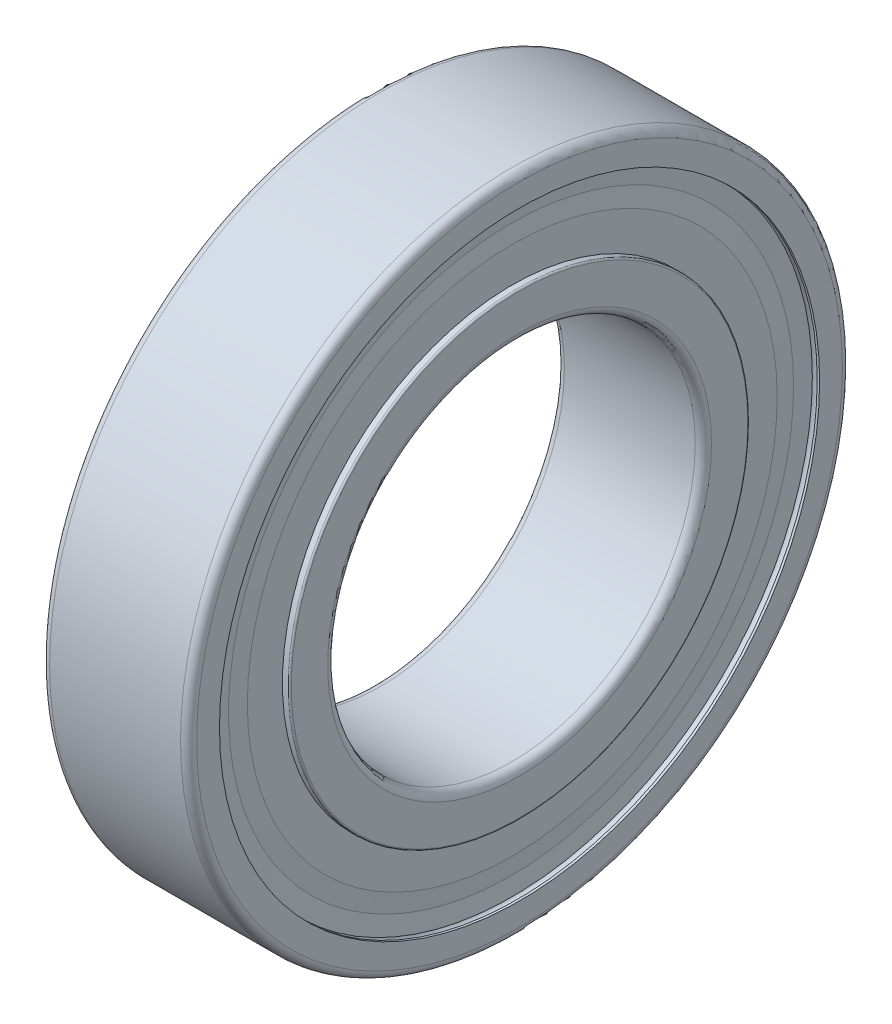
ISO-10303-21;
HEADER;
FILE_DESCRIPTION(('STEP AP214'),'2;1');
FILE_NAME('part.step','',(''),(''),'','','');
FILE_SCHEMA(('AUTOMOTIVE_DESIGN { 1 0 10303 214 1 1 1 1 }'));
ENDSEC;
DATA;
#1=APPLICATION_CONTEXT('core data for automotive mechanical design processes');
#2=APPLICATION_PROTOCOL_DEFINITION('international standard','automotive_design',2000,#1);
#3=PRODUCT_CONTEXT('',#1,'mechanical');
#4=PRODUCT('Part','Part','',(#3));
#5=PRODUCT_RELATED_PRODUCT_CATEGORY('part','',(#4));
#6=PRODUCT_DEFINITION_FORMATION('','',#4);
#7=PRODUCT_DEFINITION_CONTEXT('part definition',#1,'design');
#8=PRODUCT_DEFINITION('design','',#6,#7);
#9=PRODUCT_DEFINITION_SHAPE('','',#8);
#10=(LENGTH_UNIT() NAMED_UNIT(*) SI_UNIT(.MILLI.,.METRE.));
#11=(NAMED_UNIT(*) PLANE_ANGLE_UNIT() SI_UNIT($,.RADIAN.));
#12=(NAMED_UNIT(*) SI_UNIT($,.STERADIAN.) SOLID_ANGLE_UNIT());
#13=UNCERTAINTY_MEASURE_WITH_UNIT(LENGTH_MEASURE(1.E-05),#10,'distance_accuracy_value','');
#14=(GEOMETRIC_REPRESENTATION_CONTEXT(3) GLOBAL_UNCERTAINTY_ASSIGNED_CONTEXT((#13)) GLOBAL_UNIT_ASSIGNED_CONTEXT((#10,
#11,#12)) REPRESENTATION_CONTEXT('',''));
#15=CARTESIAN_POINT('',(0.,0.,0.));
#16=DIRECTION('',(0.,0.,1.));
#17=DIRECTION('',(1.,0.,0.));
#18=AXIS2_PLACEMENT_3D('',#15,#16,#17);
#19=CARTESIAN_POINT('',(18.68,0.,0.));
#20=DIRECTION('',(1.,0.,0.));
#21=DIRECTION('',(0.,0.,-1.));
#22=AXIS2_PLACEMENT_3D('',#19,#20,#21);
#23=CONICAL_SURFACE('',#22,40.805,1.4335885696);
#24=CARTESIAN_POINT('',(18.68,0.,0.));
#25=DIRECTION('',(1.,0.,0.));
#26=DIRECTION('',(0.,0.,-1.));
#27=AXIS2_PLACEMENT_3D('',#24,#25,#26);
#28=CIRCLE('',#27,40.805);
#29=CARTESIAN_POINT('',(18.68,0.,-40.805));
#30=VERTEX_POINT('',#29);
#31=EDGE_CURVE('P0_E40',#30,#30,#28,.T.);
#32=ORIENTED_EDGE('',*,*,#31,.F.);
#33=EDGE_LOOP('',(#32));
#34=FACE_BOUND('',#33,.T.);
#35=CARTESIAN_POINT('',(18.35,0.,0.));
#36=DIRECTION('',(1.,0.,0.));
#37=DIRECTION('',(0.,0.,-1.));
#38=AXIS2_PLACEMENT_3D('',#35,#36,#37);
#39=CIRCLE('',#38,38.415);
#40=CARTESIAN_POINT('',(18.35,0.,-38.415));
#41=VERTEX_POINT('',#40);
#42=EDGE_CURVE('P0_E11',#41,#41,#39,.T.);
#43=ORIENTED_EDGE('',*,*,#42,.T.);
#44=EDGE_LOOP('',(#43));
#45=FACE_BOUND('',#44,.T.);
#46=ADVANCED_FACE('P0_F17',(#34,#45),#23,.T.);
#47=CARTESIAN_POINT('',(18.35,38.415,0.));
#48=DIRECTION('',(-1.,0.,0.));
#49=DIRECTION('',(0.,0.,1.));
#50=AXIS2_PLACEMENT_3D('',#47,#48,#49);
#51=PLANE('',#50);
#52=ORIENTED_EDGE('',*,*,#42,.F.);
#53=EDGE_LOOP('',(#52));
#54=FACE_BOUND('',#53,.T.);
#55=CARTESIAN_POINT('',(18.35,0.,0.));
#56=DIRECTION('',(1.,0.,0.));
#57=DIRECTION('',(0.,0.,-1.));
#58=AXIS2_PLACEMENT_3D('',#55,#56,#57);
#59=CIRCLE('',#58,36.025);
#60=CARTESIAN_POINT('',(18.35,0.,-36.025));
#61=VERTEX_POINT('',#60);
#62=EDGE_CURVE('P0_E28',#61,#61,#59,.T.);
#63=ORIENTED_EDGE('',*,*,#62,.T.);
#64=EDGE_LOOP('',(#63));
#65=FACE_BOUND('',#64,.T.);
#66=ADVANCED_FACE('P0_F246',(#54,#65),#51,.T.);
#67=CARTESIAN_POINT('',(0.99,0.,0.));
#68=DIRECTION('',(-1.,0.,0.));
#69=DIRECTION('',(0.,0.,1.));
#70=AXIS2_PLACEMENT_3D('',#67,#68,#69);
#71=CONICAL_SURFACE('',#70,40.805,1.5018680397);
#72=CARTESIAN_POINT('',(0.99,0.,0.));
#73=DIRECTION('',(1.,0.,0.));
#74=DIRECTION('',(0.,0.,-1.));
#75=AXIS2_PLACEMENT_3D('',#72,#73,#74);
#76=CIRCLE('',#75,40.805);
#77=CARTESIAN_POINT('',(0.99,0.,-40.805));
#78=VERTEX_POINT('',#77);
#79=EDGE_CURVE('P0_E156',#78,#78,#76,.T.);
#80=ORIENTED_EDGE('',*,*,#79,.F.);
#81=EDGE_LOOP('',(#80));
#82=FACE_BOUND('',#81,.T.);
#83=CARTESIAN_POINT('',(1.155,0.,0.));
#84=DIRECTION('',(1.,0.,0.));
#85=DIRECTION('',(0.,0.,-1.));
#86=AXIS2_PLACEMENT_3D('',#83,#84,#85);
#87=CIRCLE('',#86,38.415);
#88=CARTESIAN_POINT('',(1.155,0.,-38.415));
#89=VERTEX_POINT('',#88);
#90=EDGE_CURVE('P0_E148',#89,#89,#87,.T.);
#91=ORIENTED_EDGE('',*,*,#90,.T.);
#92=EDGE_LOOP('',(#91));
#93=FACE_BOUND('',#92,.T.);
#94=ADVANCED_FACE('P0_F242',(#82,#93),#71,.F.);
#95=CARTESIAN_POINT('',(50.,0.,0.));
#96=DIRECTION('',(-1.,0.,0.));
#97=DIRECTION('',(0.,0.,-1.));
#98=AXIS2_PLACEMENT_3D('',#95,#96,#97);
#99=CYLINDRICAL_SURFACE('',#98,31.255);
#100=CARTESIAN_POINT('',(18.679309623431,0.,0.));
#101=DIRECTION('',(1.,0.,0.));
#102=DIRECTION('',(0.,0.,1.));
#103=AXIS2_PLACEMENT_3D('',#100,#101,#102);
#104=CIRCLE('',#103,31.255);
#105=CARTESIAN_POINT('',(18.679309623431,0.,31.255));
#106=VERTEX_POINT('',#105);
#107=EDGE_CURVE('P0_E170',#106,#106,#104,.T.);
#108=ORIENTED_EDGE('',*,*,#107,.F.);
#109=EDGE_LOOP('',(#108));
#110=FACE_BOUND('',#109,.T.);
#111=CARTESIAN_POINT('',(15.1281063756517,0.,0.));
#112=DIRECTION('',(1.,0.,0.));
#113=DIRECTION('',(0.,0.,-1.));
#114=AXIS2_PLACEMENT_3D('',#111,#112,#113);
#115=CIRCLE('',#114,31.255);
#116=CARTESIAN_POINT('',(15.1281063756517,0.,-31.255));
#117=VERTEX_POINT('',#116);
#118=EDGE_CURVE('P0_E140',#117,#117,#115,.T.);
#119=ORIENTED_EDGE('',*,*,#118,.T.);
#120=EDGE_LOOP('',(#119));
#121=FACE_BOUND('',#120,.T.);
#122=ADVANCED_FACE('P0_F245',(#110,#121),#99,.T.);
#123=CARTESIAN_POINT('',(50.,0.,0.));
#124=DIRECTION('',(-1.,0.,0.));
#125=DIRECTION('',(0.,0.,-1.));
#126=AXIS2_PLACEMENT_3D('',#123,#124,#125);
#127=CYLINDRICAL_SURFACE('',#126,31.255);
#128=CARTESIAN_POINT('',(0.99,0.,0.));
#129=DIRECTION('',(1.,0.,0.));
#130=DIRECTION('',(0.,0.,1.));
#131=AXIS2_PLACEMENT_3D('',#128,#129,#130);
#132=CIRCLE('',#131,31.255);
#133=CARTESIAN_POINT('',(0.99,0.,31.255));
#134=VERTEX_POINT('',#133);
#135=EDGE_CURVE('P0_E176',#134,#134,#132,.T.);
#136=ORIENTED_EDGE('',*,*,#135,.F.);
#137=EDGE_LOOP('',(#136));
#138=FACE_BOUND('',#137,.T.);
#139=CARTESIAN_POINT('',(0.22,0.,0.));
#140=DIRECTION('',(1.,0.,0.));
#141=DIRECTION('',(0.,0.,-1.));
#142=AXIS2_PLACEMENT_3D('',#139,#140,#141);
#143=CIRCLE('',#142,31.255);
#144=CARTESIAN_POINT('',(0.22,0.,-31.255));
#145=VERTEX_POINT('',#144);
#146=EDGE_CURVE('P0_E135',#145,#145,#143,.T.);
#147=ORIENTED_EDGE('',*,*,#146,.T.);
#148=EDGE_LOOP('',(#147));
#149=FACE_BOUND('',#148,.T.);
#150=ADVANCED_FACE('P0_F259',(#138,#149),#127,.T.);
#151=CARTESIAN_POINT('',(50.,0.,0.));
#152=DIRECTION('',(-1.,0.,0.));
#153=DIRECTION('',(0.,0.,-1.));
#154=AXIS2_PLACEMENT_3D('',#151,#152,#153);
#155=CYLINDRICAL_SURFACE('',#154,31.255);
#156=CARTESIAN_POINT('',(19.78,0.,0.));
#157=DIRECTION('',(1.,0.,0.));
#158=DIRECTION('',(0.,0.,-1.));
#159=AXIS2_PLACEMENT_3D('',#156,#157,#158);
#160=CIRCLE('',#159,31.255);
#161=CARTESIAN_POINT('',(19.78,0.,-31.255));
#162=VERTEX_POINT('',#161);
#163=EDGE_CURVE('P0_E152',#162,#162,#160,.T.);
#164=ORIENTED_EDGE('',*,*,#163,.F.);
#165=EDGE_LOOP('',(#164));
#166=FACE_BOUND('',#165,.T.);
#167=CARTESIAN_POINT('',(19.01,0.,0.));
#168=DIRECTION('',(-1.,0.,0.));
#169=DIRECTION('',(0.,0.,-1.));
#170=AXIS2_PLACEMENT_3D('',#167,#168,#169);
#171=CIRCLE('',#170,31.255);
#172=CARTESIAN_POINT('',(19.01,0.,-31.255));
#173=VERTEX_POINT('',#172);
#174=EDGE_CURVE('P0_E216',#173,#173,#171,.T.);
#175=ORIENTED_EDGE('',*,*,#174,.F.);
#176=EDGE_LOOP('',(#175));
#177=FACE_BOUND('',#176,.T.);
#178=ADVANCED_FACE('P0_F261',(#166,#177),#155,.T.);
#179=CARTESIAN_POINT('',(10.,0.,0.));
#180=DIRECTION('',(1.,0.,0.));
#181=DIRECTION('',(0.,0.,-1.));
#182=AXIS2_PLACEMENT_3D('',#179,#180,#181);
#183=TOROIDAL_SURFACE('',#182,35.,6.35);
#184=CARTESIAN_POINT('',(4.87189362434826,0.,0.));
#185=DIRECTION('',(1.,0.,0.));
#186=DIRECTION('',(0.,0.,-1.));
#187=AXIS2_PLACEMENT_3D('',#184,#185,#186);
#188=CIRCLE('',#187,31.255);
#189=CARTESIAN_POINT('',(4.87189362434826,0.,-31.255));
#190=VERTEX_POINT('',#189);
#191=EDGE_CURVE('P0_E141',#190,#190,#188,.T.);
#192=ORIENTED_EDGE('',*,*,#191,.T.);
#193=EDGE_LOOP('',(#192));
#194=FACE_BOUND('',#193,.T.);
#195=ORIENTED_EDGE('',*,*,#118,.F.);
#196=EDGE_LOOP('',(#195));
#197=FACE_BOUND('',#196,.T.);
#198=ADVANCED_FACE('P0_F269',(#194,#197),#183,.F.);
#199=CARTESIAN_POINT('',(19.78,0.,0.));
#200=DIRECTION('',(1.,0.,0.));
#201=DIRECTION('',(0.,0.,-1.));
#202=AXIS2_PLACEMENT_3D('',#199,#200,#201);
#203=TOROIDAL_SURFACE('',#202,31.035,0.22);
#204=CARTESIAN_POINT('',(20.,0.,0.));
#205=DIRECTION('',(1.,0.,0.));
#206=DIRECTION('',(0.,0.,-1.));
#207=AXIS2_PLACEMENT_3D('',#204,#205,#206);
#208=CIRCLE('',#207,31.035);
#209=CARTESIAN_POINT('',(20.,0.,-31.035));
#210=VERTEX_POINT('',#209);
#211=EDGE_CURVE('P0_E158',#210,#210,#208,.T.);
#212=ORIENTED_EDGE('',*,*,#211,.F.);
#213=EDGE_LOOP('',(#212));
#214=FACE_BOUND('',#213,.T.);
#215=ORIENTED_EDGE('',*,*,#163,.T.);
#216=EDGE_LOOP('',(#215));
#217=FACE_BOUND('',#216,.T.);
#218=ADVANCED_FACE('P0_F321',(#214,#217),#203,.T.);
#219=CARTESIAN_POINT('',(20.,26.1,0.));
#220=DIRECTION('',(1.,0.,0.));
#221=DIRECTION('',(0.,1.,0.));
#222=AXIS2_PLACEMENT_3D('',#219,#220,#221);
#223=PLANE('',#222);
#224=ORIENTED_EDGE('',*,*,#211,.T.);
#225=EDGE_LOOP('',(#224));
#226=FACE_BOUND('',#225,.T.);
#227=CARTESIAN_POINT('',(20.,0.,0.));
#228=DIRECTION('',(1.,0.,0.));
#229=DIRECTION('',(0.,0.,-1.));
#230=AXIS2_PLACEMENT_3D('',#227,#228,#229);
#231=CIRCLE('',#230,26.1);
#232=CARTESIAN_POINT('',(20.,0.,-26.1));
#233=VERTEX_POINT('',#232);
#234=EDGE_CURVE('P0_E161',#233,#233,#231,.T.);
#235=ORIENTED_EDGE('',*,*,#234,.F.);
#236=EDGE_LOOP('',(#235));
#237=FACE_BOUND('',#236,.T.);
#238=ADVANCED_FACE('P0_F336',(#226,#237),#223,.T.);
#239=CARTESIAN_POINT('',(18.9,0.,0.));
#240=DIRECTION('',(1.,0.,0.));
#241=DIRECTION('',(0.,0.,-1.));
#242=AXIS2_PLACEMENT_3D('',#239,#240,#241);
#243=TOROIDAL_SURFACE('',#242,26.1,1.1);
#244=CARTESIAN_POINT('',(18.9,0.,0.));
#245=DIRECTION('',(1.,0.,0.));
#246=DIRECTION('',(0.,0.,-1.));
#247=AXIS2_PLACEMENT_3D('',#244,#245,#246);
#248=CIRCLE('',#247,25.);
#249=CARTESIAN_POINT('',(18.9,0.,-25.));
#250=VERTEX_POINT('',#249);
#251=EDGE_CURVE('P0_E162',#250,#250,#248,.T.);
#252=ORIENTED_EDGE('',*,*,#251,.F.);
#253=EDGE_LOOP('',(#252));
#254=FACE_BOUND('',#253,.T.);
#255=ORIENTED_EDGE('',*,*,#234,.T.);
#256=EDGE_LOOP('',(#255));
#257=FACE_BOUND('',#256,.T.);
#258=ADVANCED_FACE('P0_F19',(#254,#257),#243,.T.);
#259=CARTESIAN_POINT('',(50.,0.,0.));
#260=DIRECTION('',(-1.,0.,0.));
#261=DIRECTION('',(0.,0.,-1.));
#262=AXIS2_PLACEMENT_3D('',#259,#260,#261);
#263=CYLINDRICAL_SURFACE('',#262,25.);
#264=CARTESIAN_POINT('',(1.1,0.,0.));
#265=DIRECTION('',(1.,0.,0.));
#266=DIRECTION('',(0.,0.,-1.));
#267=AXIS2_PLACEMENT_3D('',#264,#265,#266);
#268=CIRCLE('',#267,25.);
#269=CARTESIAN_POINT('',(1.1,0.,-25.));
#270=VERTEX_POINT('',#269);
#271=EDGE_CURVE('P0_E166',#270,#270,#268,.T.);
#272=ORIENTED_EDGE('',*,*,#271,.F.);
#273=EDGE_LOOP('',(#272));
#274=FACE_BOUND('',#273,.T.);
#275=ORIENTED_EDGE('',*,*,#251,.T.);
#276=EDGE_LOOP('',(#275));
#277=FACE_BOUND('',#276,.T.);
#278=ADVANCED_FACE('P0_F300',(#274,#277),#263,.F.);
#279=CARTESIAN_POINT('',(1.1,0.,0.));
#280=DIRECTION('',(1.,0.,0.));
#281=DIRECTION('',(0.,0.,-1.));
#282=AXIS2_PLACEMENT_3D('',#279,#280,#281);
#283=TOROIDAL_SURFACE('',#282,26.1,1.1);
#284=CARTESIAN_POINT('',(0.,0.,0.));
#285=DIRECTION('',(1.,0.,0.));
#286=DIRECTION('',(0.,0.,-1.));
#287=AXIS2_PLACEMENT_3D('',#284,#285,#286);
#288=CIRCLE('',#287,26.1);
#289=CARTESIAN_POINT('',(0.,0.,-26.1));
#290=VERTEX_POINT('',#289);
#291=EDGE_CURVE('P0_E205',#290,#290,#288,.T.);
#292=ORIENTED_EDGE('',*,*,#291,.F.);
#293=EDGE_LOOP('',(#292));
#294=FACE_BOUND('',#293,.T.);
#295=ORIENTED_EDGE('',*,*,#271,.T.);
#296=EDGE_LOOP('',(#295));
#297=FACE_BOUND('',#296,.T.);
#298=ADVANCED_FACE('P0_F298',(#294,#297),#283,.T.);
#299=CARTESIAN_POINT('',(0.,31.035,0.));
#300=DIRECTION('',(-1.,0.,0.));
#301=DIRECTION('',(0.,0.,1.));
#302=AXIS2_PLACEMENT_3D('',#299,#300,#301);
#303=PLANE('',#302);
#304=CARTESIAN_POINT('',(0.,0.,0.));
#305=DIRECTION('',(1.,0.,0.));
#306=DIRECTION('',(0.,0.,-1.));
#307=AXIS2_PLACEMENT_3D('',#304,#305,#306);
#308=CIRCLE('',#307,31.035);
#309=CARTESIAN_POINT('',(0.,0.,-31.035));
#310=VERTEX_POINT('',#309);
#311=EDGE_CURVE('P0_E21',#310,#310,#308,.T.);
#312=ORIENTED_EDGE('',*,*,#311,.F.);
#313=EDGE_LOOP('',(#312));
#314=FACE_BOUND('',#313,.T.);
#315=ORIENTED_EDGE('',*,*,#291,.T.);
#316=EDGE_LOOP('',(#315));
#317=FACE_BOUND('',#316,.T.);
#318=ADVANCED_FACE('P0_F287',(#314,#317),#303,.T.);
#319=CARTESIAN_POINT('',(0.219999999999994,0.,0.));
#320=DIRECTION('',(1.,0.,0.));
#321=DIRECTION('',(0.,0.,-1.));
#322=AXIS2_PLACEMENT_3D('',#319,#320,#321);
#323=TOROIDAL_SURFACE('',#322,31.035,0.22);
#324=ORIENTED_EDGE('',*,*,#146,.F.);
#325=EDGE_LOOP('',(#324));
#326=FACE_BOUND('',#325,.T.);
#327=ORIENTED_EDGE('',*,*,#311,.T.);
#328=EDGE_LOOP('',(#327));
#329=FACE_BOUND('',#328,.T.);
#330=ADVANCED_FACE('P0_F136',(#326,#329),#323,.T.);
#331=CARTESIAN_POINT('',(0.99,36.025,0.));
#332=DIRECTION('',(-1.,0.,0.));
#333=DIRECTION('',(0.,0.,1.));
#334=AXIS2_PLACEMENT_3D('',#331,#332,#333);
#335=PLANE('',#334);
#336=CARTESIAN_POINT('',(0.99,0.,0.));
#337=DIRECTION('',(1.,0.,0.));
#338=DIRECTION('',(0.,0.,-1.));
#339=AXIS2_PLACEMENT_3D('',#336,#337,#338);
#340=CIRCLE('',#339,36.025);
#341=CARTESIAN_POINT('',(0.99,0.,-36.025));
#342=VERTEX_POINT('',#341);
#343=EDGE_CURVE('P0_E180',#342,#342,#340,.T.);
#344=ORIENTED_EDGE('',*,*,#343,.F.);
#345=EDGE_LOOP('',(#344));
#346=FACE_BOUND('',#345,.T.);
#347=ORIENTED_EDGE('',*,*,#135,.T.);
#348=EDGE_LOOP('',(#347));
#349=FACE_BOUND('',#348,.T.);
#350=ADVANCED_FACE('P0_F252',(#346,#349),#335,.T.);
#351=CARTESIAN_POINT('',(1.155,0.,0.));
#352=DIRECTION('',(1.,0.,0.));
#353=DIRECTION('',(0.,0.,-1.));
#354=AXIS2_PLACEMENT_3D('',#351,#352,#353);
#355=CONICAL_SURFACE('',#354,38.415,1.5018680397);
#356=ORIENTED_EDGE('',*,*,#90,.F.);
#357=EDGE_LOOP('',(#356));
#358=FACE_BOUND('',#357,.T.);
#359=ORIENTED_EDGE('',*,*,#343,.T.);
#360=EDGE_LOOP('',(#359));
#361=FACE_BOUND('',#360,.T.);
#362=ADVANCED_FACE('P0_F249',(#358,#361),#355,.T.);
#363=CARTESIAN_POINT('',(50.,0.,0.));
#364=DIRECTION('',(-1.,0.,0.));
#365=DIRECTION('',(0.,0.,-1.));
#366=AXIS2_PLACEMENT_3D('',#363,#364,#365);
#367=CYLINDRICAL_SURFACE('',#366,40.805);
#368=CARTESIAN_POINT('',(1.32,0.,0.));
#369=DIRECTION('',(1.,0.,0.));
#370=DIRECTION('',(0.,0.,-1.));
#371=AXIS2_PLACEMENT_3D('',#368,#369,#370);
#372=CIRCLE('',#371,40.805);
#373=CARTESIAN_POINT('',(1.32,0.,-40.805));
#374=VERTEX_POINT('',#373);
#375=EDGE_CURVE('P0_E188',#374,#374,#372,.T.);
#376=ORIENTED_EDGE('',*,*,#375,.F.);
#377=EDGE_LOOP('',(#376));
#378=FACE_BOUND('',#377,.T.);
#379=ORIENTED_EDGE('',*,*,#79,.T.);
#380=EDGE_LOOP('',(#379));
#381=FACE_BOUND('',#380,.T.);
#382=ADVANCED_FACE('P0_F240',(#378,#381),#367,.T.);
#383=CARTESIAN_POINT('',(1.65,0.,0.));
#384=DIRECTION('',(-1.,0.,0.));
#385=DIRECTION('',(0.,0.,1.));
#386=AXIS2_PLACEMENT_3D('',#383,#384,#385);
#387=CONICAL_SURFACE('',#386,38.415,1.4335885696);
#388=ORIENTED_EDGE('',*,*,#375,.T.);
#389=EDGE_LOOP('',(#388));
#390=FACE_BOUND('',#389,.T.);
#391=CARTESIAN_POINT('',(1.65,0.,0.));
#392=DIRECTION('',(1.,0.,0.));
#393=DIRECTION('',(0.,0.,-1.));
#394=AXIS2_PLACEMENT_3D('',#391,#392,#393);
#395=CIRCLE('',#394,38.415);
#396=CARTESIAN_POINT('',(1.65,0.,-38.415));
#397=VERTEX_POINT('',#396);
#398=EDGE_CURVE('P0_E184',#397,#397,#395,.T.);
#399=ORIENTED_EDGE('',*,*,#398,.F.);
#400=EDGE_LOOP('',(#399));
#401=FACE_BOUND('',#400,.T.);
#402=ADVANCED_FACE('P0_F305',(#390,#401),#387,.T.);
#403=CARTESIAN_POINT('',(1.65,36.025,0.));
#404=DIRECTION('',(1.,0.,0.));
#405=DIRECTION('',(0.,1.,0.));
#406=AXIS2_PLACEMENT_3D('',#403,#404,#405);
#407=PLANE('',#406);
#408=ORIENTED_EDGE('',*,*,#398,.T.);
#409=EDGE_LOOP('',(#408));
#410=FACE_BOUND('',#409,.T.);
#411=CARTESIAN_POINT('',(1.65,0.,0.));
#412=DIRECTION('',(1.,0.,0.));
#413=DIRECTION('',(0.,0.,-1.));
#414=AXIS2_PLACEMENT_3D('',#411,#412,#413);
#415=CIRCLE('',#414,36.025);
#416=CARTESIAN_POINT('',(1.65,0.,-36.025));
#417=VERTEX_POINT('',#416);
#418=EDGE_CURVE('P0_E189',#417,#417,#415,.T.);
#419=ORIENTED_EDGE('',*,*,#418,.F.);
#420=EDGE_LOOP('',(#419));
#421=FACE_BOUND('',#420,.T.);
#422=ADVANCED_FACE('P0_F292',(#410,#421),#407,.T.);
#423=CARTESIAN_POINT('',(1.32,0.,0.));
#424=DIRECTION('',(1.,0.,0.));
#425=DIRECTION('',(0.,0.,-1.));
#426=AXIS2_PLACEMENT_3D('',#423,#424,#425);
#427=CONICAL_SURFACE('',#426,31.245,1.5018680397);
#428=ORIENTED_EDGE('',*,*,#418,.T.);
#429=EDGE_LOOP('',(#428));
#430=FACE_BOUND('',#429,.T.);
#431=CARTESIAN_POINT('',(1.32069037656904,0.,0.));
#432=DIRECTION('',(-1.,0.,0.));
#433=DIRECTION('',(0.,0.,-1.));
#434=AXIS2_PLACEMENT_3D('',#431,#432,#433);
#435=CIRCLE('',#434,31.255);
#436=CARTESIAN_POINT('',(1.32069037656904,0.,-31.255));
#437=VERTEX_POINT('',#436);
#438=EDGE_CURVE('P0_E174',#437,#437,#435,.T.);
#439=ORIENTED_EDGE('',*,*,#438,.T.);
#440=EDGE_LOOP('',(#439));
#441=FACE_BOUND('',#440,.T.);
#442=ADVANCED_FACE('P0_F288',(#430,#441),#427,.F.);
#443=CARTESIAN_POINT('',(50.,0.,0.));
#444=DIRECTION('',(-1.,0.,0.));
#445=DIRECTION('',(0.,0.,-1.));
#446=AXIS2_PLACEMENT_3D('',#443,#444,#445);
#447=CYLINDRICAL_SURFACE('',#446,31.255);
#448=ORIENTED_EDGE('',*,*,#191,.F.);
#449=EDGE_LOOP('',(#448));
#450=FACE_BOUND('',#449,.T.);
#451=ORIENTED_EDGE('',*,*,#438,.F.);
#452=EDGE_LOOP('',(#451));
#453=FACE_BOUND('',#452,.T.);
#454=ADVANCED_FACE('P0_F291',(#450,#453),#447,.T.);
#455=CARTESIAN_POINT('',(18.35,0.,0.));
#456=DIRECTION('',(-1.,0.,0.));
#457=DIRECTION('',(0.,0.,1.));
#458=AXIS2_PLACEMENT_3D('',#455,#456,#457);
#459=CONICAL_SURFACE('',#458,36.025,1.5018680397);
#460=ORIENTED_EDGE('',*,*,#62,.F.);
#461=EDGE_LOOP('',(#460));
#462=FACE_BOUND('',#461,.T.);
#463=ORIENTED_EDGE('',*,*,#107,.T.);
#464=EDGE_LOOP('',(#463));
#465=FACE_BOUND('',#464,.T.);
#466=ADVANCED_FACE('P0_F296',(#462,#465),#459,.F.);
#467=CARTESIAN_POINT('',(19.01,31.245,0.));
#468=DIRECTION('',(1.,0.,0.));
#469=DIRECTION('',(0.,1.,0.));
#470=AXIS2_PLACEMENT_3D('',#467,#468,#469);
#471=PLANE('',#470);
#472=CARTESIAN_POINT('',(19.01,0.,0.));
#473=DIRECTION('',(1.,0.,0.));
#474=DIRECTION('',(0.,0.,-1.));
#475=AXIS2_PLACEMENT_3D('',#472,#473,#474);
#476=CIRCLE('',#475,36.025);
#477=CARTESIAN_POINT('',(19.01,0.,-36.025));
#478=VERTEX_POINT('',#477);
#479=EDGE_CURVE('P0_E175',#478,#478,#476,.T.);
#480=ORIENTED_EDGE('',*,*,#479,.T.);
#481=EDGE_LOOP('',(#480));
#482=FACE_BOUND('',#481,.T.);
#483=ORIENTED_EDGE('',*,*,#174,.T.);
#484=EDGE_LOOP('',(#483));
#485=FACE_BOUND('',#484,.T.);
#486=ADVANCED_FACE('P0_F310',(#482,#485),#471,.T.);
#487=CARTESIAN_POINT('',(19.01,0.,0.));
#488=DIRECTION('',(-1.,0.,0.));
#489=DIRECTION('',(0.,0.,1.));
#490=AXIS2_PLACEMENT_3D('',#487,#488,#489);
#491=CONICAL_SURFACE('',#490,36.025,1.5018680397);
#492=CARTESIAN_POINT('',(18.845,0.,0.));
#493=DIRECTION('',(1.,0.,0.));
#494=DIRECTION('',(0.,0.,-1.));
#495=AXIS2_PLACEMENT_3D('',#492,#493,#494);
#496=CIRCLE('',#495,38.415);
#497=CARTESIAN_POINT('',(18.845,0.,-38.415));
#498=VERTEX_POINT('',#497);
#499=EDGE_CURVE('P0_E210',#498,#498,#496,.T.);
#500=ORIENTED_EDGE('',*,*,#499,.T.);
#501=EDGE_LOOP('',(#500));
#502=FACE_BOUND('',#501,.T.);
#503=ORIENTED_EDGE('',*,*,#479,.F.);
#504=EDGE_LOOP('',(#503));
#505=FACE_BOUND('',#504,.T.);
#506=ADVANCED_FACE('P0_F307',(#502,#505),#491,.T.);
#507=CARTESIAN_POINT('',(18.845,0.,0.));
#508=DIRECTION('',(1.,0.,0.));
#509=DIRECTION('',(0.,0.,-1.));
#510=AXIS2_PLACEMENT_3D('',#507,#508,#509);
#511=CONICAL_SURFACE('',#510,38.415,1.5018680397);
#512=CARTESIAN_POINT('',(19.01,0.,0.));
#513=DIRECTION('',(1.,0.,0.));
#514=DIRECTION('',(0.,0.,-1.));
#515=AXIS2_PLACEMENT_3D('',#512,#513,#514);
#516=CIRCLE('',#515,40.805);
#517=CARTESIAN_POINT('',(19.01,0.,-40.805));
#518=VERTEX_POINT('',#517);
#519=EDGE_CURVE('P0_E182',#518,#518,#516,.T.);
#520=ORIENTED_EDGE('',*,*,#519,.T.);
#521=EDGE_LOOP('',(#520));
#522=FACE_BOUND('',#521,.T.);
#523=ORIENTED_EDGE('',*,*,#499,.F.);
#524=EDGE_LOOP('',(#523));
#525=FACE_BOUND('',#524,.T.);
#526=ADVANCED_FACE('P0_F309',(#522,#525),#511,.F.);
#527=CARTESIAN_POINT('',(50.,0.,0.));
#528=DIRECTION('',(-1.,0.,0.));
#529=DIRECTION('',(0.,0.,-1.));
#530=AXIS2_PLACEMENT_3D('',#527,#528,#529);
#531=CYLINDRICAL_SURFACE('',#530,40.805);
#532=ORIENTED_EDGE('',*,*,#519,.F.);
#533=EDGE_LOOP('',(#532));
#534=FACE_BOUND('',#533,.T.);
#535=ORIENTED_EDGE('',*,*,#31,.T.);
#536=EDGE_LOOP('',(#535));
#537=FACE_BOUND('',#536,.T.);
#538=ADVANCED_FACE('P0_F324',(#534,#537),#531,.T.);
#539=CLOSED_SHELL('',(#46,#66,#94,#122,#150,#178,#198,#218,#238,#258,#278,#298,#318,#330,#350,
#362,#382,#402,#422,#442,#454,#466,#486,#506,#526,#538));
#540=MANIFOLD_SOLID_BREP('P0_B1',#539);
#541=CARTESIAN_POINT('',(1.09999999999998,0.,0.));
#542=DIRECTION('',(1.,0.,0.));
#543=DIRECTION('',(0.,0.,-1.));
#544=AXIS2_PLACEMENT_3D('',#541,#542,#543);
#545=TOROIDAL_SURFACE('',#544,43.9,1.1);
#546=CARTESIAN_POINT('',(1.1,0.,0.));
#547=DIRECTION('',(1.,0.,0.));
#548=DIRECTION('',(0.,0.,-1.));
#549=AXIS2_PLACEMENT_3D('',#546,#547,#548);
#550=CIRCLE('',#549,45.);
#551=CARTESIAN_POINT('',(1.1,0.,-45.));
#552=VERTEX_POINT('',#551);
#553=EDGE_CURVE('P1_E40',#552,#552,#550,.T.);
#554=ORIENTED_EDGE('',*,*,#553,.F.);
#555=EDGE_LOOP('',(#554));
#556=FACE_BOUND('',#555,.T.);
#557=CARTESIAN_POINT('',(0.,0.,0.));
#558=DIRECTION('',(1.,0.,0.));
#559=DIRECTION('',(0.,0.,-1.));
#560=AXIS2_PLACEMENT_3D('',#557,#558,#559);
#561=CIRCLE('',#560,43.9);
#562=CARTESIAN_POINT('',(0.,0.,-43.9));
#563=VERTEX_POINT('',#562);
#564=EDGE_CURVE('P1_E11',#563,#563,#561,.T.);
#565=ORIENTED_EDGE('',*,*,#564,.T.);
#566=EDGE_LOOP('',(#565));
#567=FACE_BOUND('',#566,.T.);
#568=ADVANCED_FACE('P1_F17',(#556,#567),#545,.T.);
#569=CARTESIAN_POINT('',(0.,43.9,0.));
#570=DIRECTION('',(-1.,0.,0.));
#571=DIRECTION('',(0.,0.,1.));
#572=AXIS2_PLACEMENT_3D('',#569,#570,#571);
#573=PLANE('',#572);
#574=ORIENTED_EDGE('',*,*,#564,.F.);
#575=EDGE_LOOP('',(#574));
#576=FACE_BOUND('',#575,.T.);
#577=CARTESIAN_POINT('',(0.,0.,0.));
#578=DIRECTION('',(1.,0.,0.));
#579=DIRECTION('',(0.,0.,-1.));
#580=AXIS2_PLACEMENT_3D('',#577,#578,#579);
#581=CIRCLE('',#580,40.805);
#582=CARTESIAN_POINT('',(0.,0.,-40.805));
#583=VERTEX_POINT('',#582);
#584=EDGE_CURVE('P1_E28',#583,#583,#581,.T.);
#585=ORIENTED_EDGE('',*,*,#584,.T.);
#586=EDGE_LOOP('',(#585));
#587=FACE_BOUND('',#586,.T.);
#588=ADVANCED_FACE('P1_F174',(#576,#587),#573,.T.);
#589=CARTESIAN_POINT('',(50.,0.,0.));
#590=DIRECTION('',(-1.,0.,0.));
#591=DIRECTION('',(0.,0.,-1.));
#592=AXIS2_PLACEMENT_3D('',#589,#590,#591);
#593=CYLINDRICAL_SURFACE('',#592,40.805);
#594=ORIENTED_EDGE('',*,*,#584,.F.);
#595=EDGE_LOOP('',(#594));
#596=FACE_BOUND('',#595,.T.);
#597=CARTESIAN_POINT('',(0.33,0.,0.));
#598=DIRECTION('',(1.,0.,0.));
#599=DIRECTION('',(0.,0.,-1.));
#600=AXIS2_PLACEMENT_3D('',#597,#598,#599);
#601=CIRCLE('',#600,40.805);
#602=CARTESIAN_POINT('',(0.33,0.,-40.805));
#603=VERTEX_POINT('',#602);
#604=EDGE_CURVE('P1_E102',#603,#603,#601,.T.);
#605=ORIENTED_EDGE('',*,*,#604,.T.);
#606=EDGE_LOOP('',(#605));
#607=FACE_BOUND('',#606,.T.);
#608=ADVANCED_FACE('P1_F180',(#596,#607),#593,.F.);
#609=CARTESIAN_POINT('',(0.99,0.,0.));
#610=DIRECTION('',(1.,0.,0.));
#611=DIRECTION('',(0.,0.,-1.));
#612=AXIS2_PLACEMENT_3D('',#609,#610,#611);
#613=TOROIDAL_SURFACE('',#612,40.805,0.66);
#614=CARTESIAN_POINT('',(1.65,0.,0.));
#615=DIRECTION('',(1.,0.,0.));
#616=DIRECTION('',(0.,0.,-1.));
#617=AXIS2_PLACEMENT_3D('',#614,#615,#616);
#618=CIRCLE('',#617,40.805);
#619=CARTESIAN_POINT('',(1.65,0.,-40.805));
#620=VERTEX_POINT('',#619);
#621=EDGE_CURVE('P1_E108',#620,#620,#618,.T.);
#622=ORIENTED_EDGE('',*,*,#621,.T.);
#623=EDGE_LOOP('',(#622));
#624=FACE_BOUND('',#623,.T.);
#625=ORIENTED_EDGE('',*,*,#604,.F.);
#626=EDGE_LOOP('',(#625));
#627=FACE_BOUND('',#626,.T.);
#628=CARTESIAN_POINT('',(0.99,0.,-41.465));
#629=VERTEX_POINT('',#628);
#630=VERTEX_LOOP('',#629);
#631=FACE_BOUND('',#630,.T.);
#632=ADVANCED_FACE('P1_F196',(#624,#627,#631),#613,.F.);
#633=CARTESIAN_POINT('',(1.65,0.,0.));
#634=DIRECTION('',(-1.,0.,0.));
#635=DIRECTION('',(0.,0.,1.));
#636=AXIS2_PLACEMENT_3D('',#633,#634,#635);
#637=CONICAL_SURFACE('',#636,40.805,1.3962634016);
#638=ORIENTED_EDGE('',*,*,#621,.F.);
#639=EDGE_LOOP('',(#638));
#640=FACE_BOUND('',#639,.T.);
#641=CARTESIAN_POINT('',(1.92330682009812,0.,0.));
#642=DIRECTION('',(1.,0.,0.));
#643=DIRECTION('',(0.,0.,-1.));
#644=AXIS2_PLACEMENT_3D('',#641,#642,#643);
#645=CIRCLE('',#644,39.255);
#646=CARTESIAN_POINT('',(1.92330682009812,0.,-39.255));
#647=VERTEX_POINT('',#646);
#648=EDGE_CURVE('P1_E113',#647,#647,#645,.T.);
#649=ORIENTED_EDGE('',*,*,#648,.T.);
#650=EDGE_LOOP('',(#649));
#651=FACE_BOUND('',#650,.T.);
#652=ADVANCED_FACE('P1_F109',(#640,#651),#637,.F.);
#653=CARTESIAN_POINT('',(50.,0.,0.));
#654=DIRECTION('',(-1.,0.,0.));
#655=DIRECTION('',(0.,0.,-1.));
#656=AXIS2_PLACEMENT_3D('',#653,#654,#655);
#657=CYLINDRICAL_SURFACE('',#656,39.255);
#658=ORIENTED_EDGE('',*,*,#648,.F.);
#659=EDGE_LOOP('',(#658));
#660=FACE_BOUND('',#659,.T.);
#661=CARTESIAN_POINT('',(5.28645833793739,0.,0.));
#662=DIRECTION('',(1.,0.,0.));
#663=DIRECTION('',(0.,0.,-1.));
#664=AXIS2_PLACEMENT_3D('',#661,#662,#663);
#665=CIRCLE('',#664,39.255);
#666=CARTESIAN_POINT('',(5.28645833793739,0.,-39.255));
#667=VERTEX_POINT('',#666);
#668=EDGE_CURVE('P1_E122',#667,#667,#665,.T.);
#669=ORIENTED_EDGE('',*,*,#668,.T.);
#670=EDGE_LOOP('',(#669));
#671=FACE_BOUND('',#670,.T.);
#672=ADVANCED_FACE('P1_F19',(#660,#671),#657,.F.);
#673=CARTESIAN_POINT('',(10.,0.,0.));
#674=DIRECTION('',(1.,0.,0.));
#675=DIRECTION('',(0.,0.,-1.));
#676=AXIS2_PLACEMENT_3D('',#673,#674,#675);
#677=TOROIDAL_SURFACE('',#676,35.,6.35);
#678=CARTESIAN_POINT('',(14.7135416620626,0.,0.));
#679=DIRECTION('',(1.,0.,0.));
#680=DIRECTION('',(0.,0.,-1.));
#681=AXIS2_PLACEMENT_3D('',#678,#679,#680);
#682=CIRCLE('',#681,39.255);
#683=CARTESIAN_POINT('',(14.7135416620626,0.,-39.255));
#684=VERTEX_POINT('',#683);
#685=EDGE_CURVE('P1_E137',#684,#684,#682,.T.);
#686=ORIENTED_EDGE('',*,*,#685,.T.);
#687=EDGE_LOOP('',(#686));
#688=FACE_BOUND('',#687,.T.);
#689=ORIENTED_EDGE('',*,*,#668,.F.);
#690=EDGE_LOOP('',(#689));
#691=FACE_BOUND('',#690,.T.);
#692=CARTESIAN_POINT('',(10.,0.,-41.35));
#693=VERTEX_POINT('',#692);
#694=VERTEX_LOOP('',#693);
#695=FACE_BOUND('',#694,.T.);
#696=ADVANCED_FACE('P1_F184',(#688,#691,#695),#677,.F.);
#697=CARTESIAN_POINT('',(50.,0.,0.));
#698=DIRECTION('',(-1.,0.,0.));
#699=DIRECTION('',(0.,0.,-1.));
#700=AXIS2_PLACEMENT_3D('',#697,#698,#699);
#701=CYLINDRICAL_SURFACE('',#700,39.255);
#702=ORIENTED_EDGE('',*,*,#685,.F.);
#703=EDGE_LOOP('',(#702));
#704=FACE_BOUND('',#703,.T.);
#705=CARTESIAN_POINT('',(18.0766931799019,0.,0.));
#706=DIRECTION('',(1.,0.,0.));
#707=DIRECTION('',(0.,0.,-1.));
#708=AXIS2_PLACEMENT_3D('',#705,#706,#707);
#709=CIRCLE('',#708,39.255);
#710=CARTESIAN_POINT('',(18.0766931799019,0.,-39.255));
#711=VERTEX_POINT('',#710);
#712=EDGE_CURVE('P1_E21',#711,#711,#709,.T.);
#713=ORIENTED_EDGE('',*,*,#712,.T.);
#714=EDGE_LOOP('',(#713));
#715=FACE_BOUND('',#714,.T.);
#716=ADVANCED_FACE('P1_F187',(#704,#715),#701,.F.);
#717=CARTESIAN_POINT('',(18.0766931799019,0.,0.));
#718=DIRECTION('',(1.,0.,0.));
#719=DIRECTION('',(0.,0.,-1.));
#720=AXIS2_PLACEMENT_3D('',#717,#718,#719);
#721=CONICAL_SURFACE('',#720,39.255,1.3962634016);
#722=CARTESIAN_POINT('',(18.35,0.,0.));
#723=DIRECTION('',(1.,0.,0.));
#724=DIRECTION('',(0.,0.,-1.));
#725=AXIS2_PLACEMENT_3D('',#722,#723,#724);
#726=CIRCLE('',#725,40.805);
#727=CARTESIAN_POINT('',(18.35,0.,-40.805));
#728=VERTEX_POINT('',#727);
#729=EDGE_CURVE('P1_E140',#728,#728,#726,.T.);
#730=ORIENTED_EDGE('',*,*,#729,.T.);
#731=EDGE_LOOP('',(#730));
#732=FACE_BOUND('',#731,.T.);
#733=ORIENTED_EDGE('',*,*,#712,.F.);
#734=EDGE_LOOP('',(#733));
#735=FACE_BOUND('',#734,.T.);
#736=ADVANCED_FACE('P1_F189',(#732,#735),#721,.F.);
#737=CARTESIAN_POINT('',(19.01,0.,0.));
#738=DIRECTION('',(1.,0.,0.));
#739=DIRECTION('',(0.,0.,-1.));
#740=AXIS2_PLACEMENT_3D('',#737,#738,#739);
#741=TOROIDAL_SURFACE('',#740,40.805,0.66);
#742=CARTESIAN_POINT('',(19.67,0.,0.));
#743=DIRECTION('',(1.,0.,0.));
#744=DIRECTION('',(0.,0.,-1.));
#745=AXIS2_PLACEMENT_3D('',#742,#743,#744);
#746=CIRCLE('',#745,40.805);
#747=CARTESIAN_POINT('',(19.67,0.,-40.805));
#748=VERTEX_POINT('',#747);
#749=EDGE_CURVE('P1_E133',#748,#748,#746,.T.);
#750=ORIENTED_EDGE('',*,*,#749,.T.);
#751=EDGE_LOOP('',(#750));
#752=FACE_BOUND('',#751,.T.);
#753=ORIENTED_EDGE('',*,*,#729,.F.);
#754=EDGE_LOOP('',(#753));
#755=FACE_BOUND('',#754,.T.);
#756=CARTESIAN_POINT('',(19.01,0.,-41.465));
#757=VERTEX_POINT('',#756);
#758=VERTEX_LOOP('',#757);
#759=FACE_BOUND('',#758,.T.);
#760=ADVANCED_FACE('P1_F192',(#752,#755,#759),#741,.F.);
#761=CARTESIAN_POINT('',(50.,0.,0.));
#762=DIRECTION('',(-1.,0.,0.));
#763=DIRECTION('',(0.,0.,-1.));
#764=AXIS2_PLACEMENT_3D('',#761,#762,#763);
#765=CYLINDRICAL_SURFACE('',#764,40.805);
#766=ORIENTED_EDGE('',*,*,#749,.F.);
#767=EDGE_LOOP('',(#766));
#768=FACE_BOUND('',#767,.T.);
#769=CARTESIAN_POINT('',(20.,0.,0.));
#770=DIRECTION('',(1.,0.,0.));
#771=DIRECTION('',(0.,0.,-1.));
#772=AXIS2_PLACEMENT_3D('',#769,#770,#771);
#773=CIRCLE('',#772,40.805);
#774=CARTESIAN_POINT('',(20.,0.,-40.805));
#775=VERTEX_POINT('',#774);
#776=EDGE_CURVE('P1_E129',#775,#775,#773,.T.);
#777=ORIENTED_EDGE('',*,*,#776,.T.);
#778=EDGE_LOOP('',(#777));
#779=FACE_BOUND('',#778,.T.);
#780=ADVANCED_FACE('P1_F170',(#768,#779),#765,.F.);
#781=CARTESIAN_POINT('',(20.,40.805,0.));
#782=DIRECTION('',(1.,0.,0.));
#783=DIRECTION('',(0.,1.,0.));
#784=AXIS2_PLACEMENT_3D('',#781,#782,#783);
#785=PLANE('',#784);
#786=CARTESIAN_POINT('',(20.,0.,0.));
#787=DIRECTION('',(1.,0.,0.));
#788=DIRECTION('',(0.,0.,-1.));
#789=AXIS2_PLACEMENT_3D('',#786,#787,#788);
#790=CIRCLE('',#789,43.9);
#791=CARTESIAN_POINT('',(20.,0.,-43.9));
#792=VERTEX_POINT('',#791);
#793=EDGE_CURVE('P1_E126',#792,#792,#790,.T.);
#794=ORIENTED_EDGE('',*,*,#793,.T.);
#795=EDGE_LOOP('',(#794));
#796=FACE_BOUND('',#795,.T.);
#797=ORIENTED_EDGE('',*,*,#776,.F.);
#798=EDGE_LOOP('',(#797));
#799=FACE_BOUND('',#798,.T.);
#800=ADVANCED_FACE('P1_F155',(#796,#799),#785,.T.);
#801=CARTESIAN_POINT('',(18.9,0.,0.));
#802=DIRECTION('',(1.,0.,0.));
#803=DIRECTION('',(0.,0.,-1.));
#804=AXIS2_PLACEMENT_3D('',#801,#802,#803);
#805=TOROIDAL_SURFACE('',#804,43.9,1.1);
#806=ORIENTED_EDGE('',*,*,#793,.F.);
#807=EDGE_LOOP('',(#806));
#808=FACE_BOUND('',#807,.T.);
#809=CARTESIAN_POINT('',(18.9,0.,0.));
#810=DIRECTION('',(1.,0.,0.));
#811=DIRECTION('',(0.,0.,-1.));
#812=AXIS2_PLACEMENT_3D('',#809,#810,#811);
#813=CIRCLE('',#812,45.);
#814=CARTESIAN_POINT('',(18.9,0.,-45.));
#815=VERTEX_POINT('',#814);
#816=EDGE_CURVE('P1_E146',#815,#815,#813,.T.);
#817=ORIENTED_EDGE('',*,*,#816,.T.);
#818=EDGE_LOOP('',(#817));
#819=FACE_BOUND('',#818,.T.);
#820=ADVANCED_FACE('P1_F158',(#808,#819),#805,.T.);
#821=CARTESIAN_POINT('',(50.,0.,0.));
#822=DIRECTION('',(-1.,0.,0.));
#823=DIRECTION('',(0.,0.,-1.));
#824=AXIS2_PLACEMENT_3D('',#821,#822,#823);
#825=CYLINDRICAL_SURFACE('',#824,45.);
#826=ORIENTED_EDGE('',*,*,#816,.F.);
#827=EDGE_LOOP('',(#826));
#828=FACE_BOUND('',#827,.T.);
#829=ORIENTED_EDGE('',*,*,#553,.T.);
#830=EDGE_LOOP('',(#829));
#831=FACE_BOUND('',#830,.T.);
#832=ADVANCED_FACE('P1_F160',(#828,#831),#825,.T.);
#833=CLOSED_SHELL('',(#568,#588,#608,#632,#652,#672,#696,#716,#736,#760,#780,#800,#820,#832));
#834=MANIFOLD_SOLID_BREP('P1_B1',#833);
#835=CARTESIAN_POINT('',(10.,35.,0.));
#836=DIRECTION('',(1.,0.,0.));
#837=DIRECTION('',(0.,-1.,0.));
#838=AXIS2_PLACEMENT_3D('',#835,#836,#837);
#839=SPHERICAL_SURFACE('',#838,6.35);
#840=CARTESIAN_POINT('',(16.35,35.,0.));
#841=VERTEX_POINT('',#840);
#842=VERTEX_LOOP('',#841);
#843=FACE_BOUND('',#842,.T.);
#844=CARTESIAN_POINT('',(3.65,35.,0.));
#845=VERTEX_POINT('',#844);
#846=VERTEX_LOOP('',#845);
#847=FACE_BOUND('',#846,.T.);
#848=ADVANCED_FACE('P2_F15',(#843,#847),#839,.T.);
#849=CLOSED_SHELL('',(#848));
#850=MANIFOLD_SOLID_BREP('P2_B1',#849);
#851=CARTESIAN_POINT('',(10.,28.3155948031232,20.5724838302366));
#852=DIRECTION('',(1.,0.,0.));
#853=DIRECTION('',(0.,-0.809016994374947,-0.587785252292473));
#854=AXIS2_PLACEMENT_3D('',#851,#852,#853);
#855=SPHERICAL_SURFACE('',#854,6.35);
#856=CARTESIAN_POINT('',(16.35,28.3155948031232,20.5724838302366));
#857=VERTEX_POINT('',#856);
#858=VERTEX_LOOP('',#857);
#859=FACE_BOUND('',#858,.T.);
#860=CARTESIAN_POINT('',(3.65,28.3155948031232,20.5724838302366));
#861=VERTEX_POINT('',#860);
#862=VERTEX_LOOP('',#861);
#863=FACE_BOUND('',#862,.T.);
#864=ADVANCED_FACE('P3_F14',(#859,#863),#855,.T.);
#865=CLOSED_SHELL('',(#864));
#866=MANIFOLD_SOLID_BREP('P3_B1',#865);
#867=CARTESIAN_POINT('',(10.,28.3155948031232,-20.5724838302366));
#868=DIRECTION('',(1.,0.,0.));
#869=DIRECTION('',(0.,-0.809016994374947,0.587785252292473));
#870=AXIS2_PLACEMENT_3D('',#867,#868,#869);
#871=SPHERICAL_SURFACE('',#870,6.35);
#872=CARTESIAN_POINT('',(16.35,28.3155948031232,-20.5724838302366));
#873=VERTEX_POINT('',#872);
#874=VERTEX_LOOP('',#873);
#875=FACE_BOUND('',#874,.T.);
#876=CARTESIAN_POINT('',(3.65,28.3155948031232,-20.5724838302366));
#877=VERTEX_POINT('',#876);
#878=VERTEX_LOOP('',#877);
#879=FACE_BOUND('',#878,.T.);
#880=ADVANCED_FACE('P4_F15',(#875,#879),#871,.T.);
#881=CLOSED_SHELL('',(#880));
#882=MANIFOLD_SOLID_BREP('P4_B1',#881);
#883=CARTESIAN_POINT('',(10.,10.8155948031232,-33.2869780703304));
#884=DIRECTION('',(1.,0.,0.));
#885=DIRECTION('',(0.,-0.309016994374948,0.951056516295153));
#886=AXIS2_PLACEMENT_3D('',#883,#884,#885);
#887=SPHERICAL_SURFACE('',#886,6.35);
#888=CARTESIAN_POINT('',(16.35,10.8155948031232,-33.2869780703304));
#889=VERTEX_POINT('',#888);
#890=VERTEX_LOOP('',#889);
#891=FACE_BOUND('',#890,.T.);
#892=CARTESIAN_POINT('',(3.65,10.8155948031232,-33.2869780703304));
#893=VERTEX_POINT('',#892);
#894=VERTEX_LOOP('',#893);
#895=FACE_BOUND('',#894,.T.);
#896=ADVANCED_FACE('P5_F15',(#891,#895),#887,.T.);
#897=CLOSED_SHELL('',(#896));
#898=MANIFOLD_SOLID_BREP('P5_B1',#897);
#899=CARTESIAN_POINT('',(10.,-10.8155948031231,-33.2869780703304));
#900=DIRECTION('',(1.,0.,0.));
#901=DIRECTION('',(0.,0.309016994374947,0.951056516295154));
#902=AXIS2_PLACEMENT_3D('',#899,#900,#901);
#903=SPHERICAL_SURFACE('',#902,6.35);
#904=CARTESIAN_POINT('',(16.35,-10.8155948031231,-33.2869780703304));
#905=VERTEX_POINT('',#904);
#906=VERTEX_LOOP('',#905);
#907=FACE_BOUND('',#906,.T.);
#908=CARTESIAN_POINT('',(3.65,-10.8155948031231,-33.2869780703304));
#909=VERTEX_POINT('',#908);
#910=VERTEX_LOOP('',#909);
#911=FACE_BOUND('',#910,.T.);
#912=ADVANCED_FACE('P6_F15',(#907,#911),#903,.T.);
#913=CLOSED_SHELL('',(#912));
#914=MANIFOLD_SOLID_BREP('P6_B1',#913);
#915=CARTESIAN_POINT('',(10.,-28.3155948031232,-20.5724838302366));
#916=DIRECTION('',(1.,0.,0.));
#917=DIRECTION('',(0.,0.809016994374947,0.587785252292473));
#918=AXIS2_PLACEMENT_3D('',#915,#916,#917);
#919=SPHERICAL_SURFACE('',#918,6.35);
#920=CARTESIAN_POINT('',(16.35,-28.3155948031232,-20.5724838302366));
#921=VERTEX_POINT('',#920);
#922=VERTEX_LOOP('',#921);
#923=FACE_BOUND('',#922,.T.);
#924=CARTESIAN_POINT('',(3.65,-28.3155948031232,-20.5724838302366));
#925=VERTEX_POINT('',#924);
#926=VERTEX_LOOP('',#925);
#927=FACE_BOUND('',#926,.T.);
#928=ADVANCED_FACE('P7_F15',(#923,#927),#919,.T.);
#929=CLOSED_SHELL('',(#928));
#930=MANIFOLD_SOLID_BREP('P7_B1',#929);
#931=CARTESIAN_POINT('',(10.,-35.,0.));
#932=DIRECTION('',(1.,0.,0.));
#933=DIRECTION('',(0.,1.,0.));
#934=AXIS2_PLACEMENT_3D('',#931,#932,#933);
#935=SPHERICAL_SURFACE('',#934,6.35);
#936=CARTESIAN_POINT('',(16.35,-35.,0.));
#937=VERTEX_POINT('',#936);
#938=VERTEX_LOOP('',#937);
#939=FACE_BOUND('',#938,.T.);
#940=CARTESIAN_POINT('',(3.65,-35.,0.));
#941=VERTEX_POINT('',#940);
#942=VERTEX_LOOP('',#941);
#943=FACE_BOUND('',#942,.T.);
#944=ADVANCED_FACE('P8_F15',(#939,#943),#935,.T.);
#945=CLOSED_SHELL('',(#944));
#946=MANIFOLD_SOLID_BREP('P8_B1',#945);
#947=CARTESIAN_POINT('',(10.,-28.3155948031232,20.5724838302365));
#948=DIRECTION('',(1.,0.,0.));
#949=DIRECTION('',(0.,0.809016994374948,-0.587785252292473));
#950=AXIS2_PLACEMENT_3D('',#947,#948,#949);
#951=SPHERICAL_SURFACE('',#950,6.35);
#952=CARTESIAN_POINT('',(16.35,-28.3155948031232,20.5724838302365));
#953=VERTEX_POINT('',#952);
#954=VERTEX_LOOP('',#953);
#955=FACE_BOUND('',#954,.T.);
#956=CARTESIAN_POINT('',(3.65,-28.3155948031232,20.5724838302365));
#957=VERTEX_POINT('',#956);
#958=VERTEX_LOOP('',#957);
#959=FACE_BOUND('',#958,.T.);
#960=ADVANCED_FACE('P9_F15',(#955,#959),#951,.T.);
#961=CLOSED_SHELL('',(#960));
#962=MANIFOLD_SOLID_BREP('P9_B1',#961);
#963=CARTESIAN_POINT('',(10.,-10.8155948031232,33.2869780703304));
#964=DIRECTION('',(1.,0.,0.));
#965=DIRECTION('',(0.,0.309016994374948,-0.951056516295153));
#966=AXIS2_PLACEMENT_3D('',#963,#964,#965);
#967=SPHERICAL_SURFACE('',#966,6.35);
#968=CARTESIAN_POINT('',(16.35,-10.8155948031232,33.2869780703304));
#969=VERTEX_POINT('',#968);
#970=VERTEX_LOOP('',#969);
#971=FACE_BOUND('',#970,.T.);
#972=CARTESIAN_POINT('',(3.65,-10.8155948031232,33.2869780703304));
#973=VERTEX_POINT('',#972);
#974=VERTEX_LOOP('',#973);
#975=FACE_BOUND('',#974,.T.);
#976=ADVANCED_FACE('P10_F15',(#971,#975),#967,.T.);
#977=CLOSED_SHELL('',(#976));
#978=MANIFOLD_SOLID_BREP('P10_B1',#977);
#979=CARTESIAN_POINT('',(10.,10.8155948031231,33.2869780703304));
#980=DIRECTION('',(1.,0.,0.));
#981=DIRECTION('',(0.,-0.309016994374947,-0.951056516295154));
#982=AXIS2_PLACEMENT_3D('',#979,#980,#981);
#983=SPHERICAL_SURFACE('',#982,6.35);
#984=CARTESIAN_POINT('',(16.35,10.8155948031231,33.2869780703304));
#985=VERTEX_POINT('',#984);
#986=VERTEX_LOOP('',#985);
#987=FACE_BOUND('',#986,.T.);
#988=CARTESIAN_POINT('',(3.65,10.8155948031231,33.2869780703304));
#989=VERTEX_POINT('',#988);
#990=VERTEX_LOOP('',#989);
#991=FACE_BOUND('',#990,.T.);
#992=ADVANCED_FACE('P11_F15',(#987,#991),#983,.T.);
#993=CLOSED_SHELL('',(#992));
#994=MANIFOLD_SOLID_BREP('P11_B1',#993);
#995=ADVANCED_BREP_SHAPE_REPRESENTATION('',(#18,#540,#834,#850,#866,#882,#898,#914,#930,#946,
#962,#978,#994),#14);
#996=SHAPE_DEFINITION_REPRESENTATION(#9,#995);
ENDSEC;
END-ISO-10303-21;
